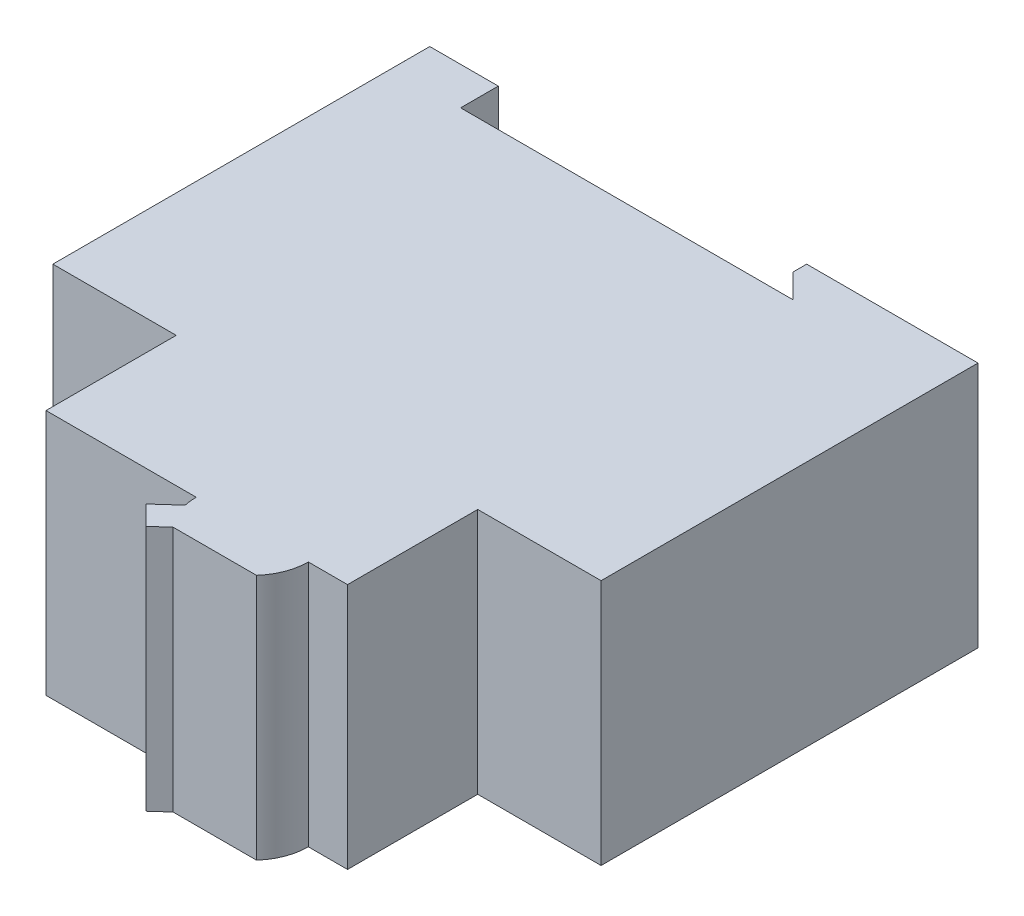
ISO-10303-21;
HEADER;
FILE_DESCRIPTION(('STEP AP214'),'2;1');
FILE_NAME('part.step','',(''),(''),'','','');
FILE_SCHEMA(('AUTOMOTIVE_DESIGN { 1 0 10303 214 1 1 1 1 }'));
ENDSEC;
DATA;
#1=APPLICATION_CONTEXT('core data for automotive mechanical design processes');
#2=APPLICATION_PROTOCOL_DEFINITION('international standard','automotive_design',2000,#1);
#3=PRODUCT_CONTEXT('',#1,'mechanical');
#4=PRODUCT('Part','Part','',(#3));
#5=PRODUCT_RELATED_PRODUCT_CATEGORY('part','',(#4));
#6=PRODUCT_DEFINITION_FORMATION('','',#4);
#7=PRODUCT_DEFINITION_CONTEXT('part definition',#1,'design');
#8=PRODUCT_DEFINITION('design','',#6,#7);
#9=PRODUCT_DEFINITION_SHAPE('','',#8);
#10=(LENGTH_UNIT() NAMED_UNIT(*) SI_UNIT(.MILLI.,.METRE.));
#11=(NAMED_UNIT(*) PLANE_ANGLE_UNIT() SI_UNIT($,.RADIAN.));
#12=(NAMED_UNIT(*) SI_UNIT($,.STERADIAN.) SOLID_ANGLE_UNIT());
#13=UNCERTAINTY_MEASURE_WITH_UNIT(LENGTH_MEASURE(1.E-05),#10,'distance_accuracy_value','');
#14=(GEOMETRIC_REPRESENTATION_CONTEXT(3) GLOBAL_UNCERTAINTY_ASSIGNED_CONTEXT((#13)) GLOBAL_UNIT_ASSIGNED_CONTEXT((#10,
#11,#12)) REPRESENTATION_CONTEXT('',''));
#15=CARTESIAN_POINT('',(0.,0.,0.));
#16=DIRECTION('',(0.,0.,1.));
#17=DIRECTION('',(1.,0.,0.));
#18=AXIS2_PLACEMENT_3D('',#15,#16,#17);
#19=CARTESIAN_POINT('',(0.,-31.,85.));
#20=DIRECTION('',(0.,1.,0.));
#21=DIRECTION('',(0.,0.,1.));
#22=AXIS2_PLACEMENT_3D('',#19,#20,#21);
#23=PLANE('',#22);
#24=DIRECTION('',(-1.,0.,0.));
#25=VECTOR('',#24,1.);
#26=CARTESIAN_POINT('',(0.,-31.,74.));
#27=LINE('',#26,#25);
#28=CARTESIAN_POINT('',(39.9193789701094,-31.,74.));
#29=VERTEX_POINT('',#28);
#30=CARTESIAN_POINT('',(18.,-31.,74.));
#31=VERTEX_POINT('',#30);
#32=EDGE_CURVE('E198',#29,#31,#27,.T.);
#33=ORIENTED_EDGE('',*,*,#32,.T.);
#34=DIRECTION('',(0.,0.,-1.));
#35=VECTOR('',#34,1.);
#36=CARTESIAN_POINT('',(18.,-31.,85.));
#37=LINE('',#36,#35);
#38=CARTESIAN_POINT('',(18.,-31.,55.));
#39=VERTEX_POINT('',#38);
#40=EDGE_CURVE('E272',#31,#39,#37,.T.);
#41=ORIENTED_EDGE('',*,*,#40,.T.);
#42=DIRECTION('',(-1.,0.,0.));
#43=VECTOR('',#42,1.);
#44=CARTESIAN_POINT('',(0.,-31.,55.));
#45=LINE('',#44,#43);
#46=CARTESIAN_POINT('',(0.,-31.,55.));
#47=VERTEX_POINT('',#46);
#48=EDGE_CURVE('E275',#39,#47,#45,.T.);
#49=ORIENTED_EDGE('',*,*,#48,.T.);
#50=DIRECTION('',(0.,0.,-1.));
#51=VECTOR('',#50,1.);
#52=CARTESIAN_POINT('',(0.,-31.,85.));
#53=LINE('',#52,#51);
#54=CARTESIAN_POINT('',(0.,-31.,0.));
#55=VERTEX_POINT('',#54);
#56=EDGE_CURVE('E298',#47,#55,#53,.T.);
#57=ORIENTED_EDGE('',*,*,#56,.T.);
#58=DIRECTION('',(1.,0.,0.));
#59=VECTOR('',#58,1.);
#60=CARTESIAN_POINT('',(0.,-31.,0.));
#61=LINE('',#60,#59);
#62=CARTESIAN_POINT('',(10.,-31.,0.));
#63=VERTEX_POINT('',#62);
#64=EDGE_CURVE('E290',#55,#63,#61,.T.);
#65=ORIENTED_EDGE('',*,*,#64,.T.);
#66=DIRECTION('',(0.,0.,1.));
#67=VECTOR('',#66,1.);
#68=CARTESIAN_POINT('',(10.,-31.,0.));
#69=LINE('',#68,#67);
#70=CARTESIAN_POINT('',(10.,-31.,5.5));
#71=VERTEX_POINT('',#70);
#72=EDGE_CURVE('E237',#63,#71,#69,.T.);
#73=ORIENTED_EDGE('',*,*,#72,.T.);
#74=DIRECTION('',(1.,0.,0.));
#75=VECTOR('',#74,1.);
#76=CARTESIAN_POINT('',(0.,-31.,5.5));
#77=LINE('',#76,#75);
#78=CARTESIAN_POINT('',(58.4999999999999,-31.,5.5));
#79=VERTEX_POINT('',#78);
#80=EDGE_CURVE('E234',#71,#79,#77,.T.);
#81=ORIENTED_EDGE('',*,*,#80,.T.);
#82=DIRECTION('',(0.70710678118654,0.,0.707106781186556));
#83=VECTOR('',#82,1.);
#84=CARTESIAN_POINT('',(26.5000000000006,-31.,-26.5));
#85=LINE('',#84,#83);
#86=CARTESIAN_POINT('',(55.,-31.,2.));
#87=VERTEX_POINT('',#86);
#88=EDGE_CURVE('E232',#87,#79,#85,.T.);
#89=ORIENTED_EDGE('',*,*,#88,.F.);
#90=DIRECTION('',(0.,0.,1.));
#91=VECTOR('',#90,1.);
#92=CARTESIAN_POINT('',(55.,-31.,0.));
#93=LINE('',#92,#91);
#94=CARTESIAN_POINT('',(55.,-31.,0.));
#95=VERTEX_POINT('',#94);
#96=EDGE_CURVE('E216',#95,#87,#93,.T.);
#97=ORIENTED_EDGE('',*,*,#96,.F.);
#98=CARTESIAN_POINT('',(80.,-31.,0.));
#99=VERTEX_POINT('',#98);
#100=EDGE_CURVE('E289',#95,#99,#61,.T.);
#101=ORIENTED_EDGE('',*,*,#100,.T.);
#102=DIRECTION('',(0.,0.,-1.));
#103=VECTOR('',#102,1.);
#104=CARTESIAN_POINT('',(80.,-31.,85.));
#105=LINE('',#104,#103);
#106=CARTESIAN_POINT('',(80.,-31.,55.));
#107=VERTEX_POINT('',#106);
#108=EDGE_CURVE('E295',#107,#99,#105,.T.);
#109=ORIENTED_EDGE('',*,*,#108,.F.);
#110=DIRECTION('',(-1.,0.,0.));
#111=VECTOR('',#110,1.);
#112=CARTESIAN_POINT('',(0.,-31.,55.));
#113=LINE('',#112,#111);
#114=CARTESIAN_POINT('',(62.,-31.,55.));
#115=VERTEX_POINT('',#114);
#116=EDGE_CURVE('E284',#107,#115,#113,.T.);
#117=ORIENTED_EDGE('',*,*,#116,.T.);
#118=DIRECTION('',(0.,0.,1.));
#119=VECTOR('',#118,1.);
#120=CARTESIAN_POINT('',(62.,-31.,85.));
#121=LINE('',#120,#119);
#122=CARTESIAN_POINT('',(62.,-31.,74.));
#123=VERTEX_POINT('',#122);
#124=EDGE_CURVE('E197',#115,#123,#121,.T.);
#125=ORIENTED_EDGE('',*,*,#124,.T.);
#126=DIRECTION('',(-1.,0.,0.));
#127=VECTOR('',#126,1.);
#128=CARTESIAN_POINT('',(0.,-31.,74.));
#129=LINE('',#128,#127);
#130=CARTESIAN_POINT('',(56.2798417876385,-31.,74.));
#131=VERTEX_POINT('',#130);
#132=EDGE_CURVE('E179',#123,#131,#129,.T.);
#133=ORIENTED_EDGE('',*,*,#132,.T.);
#134=CARTESIAN_POINT('',(48.0996103788739,-31.,74.));
#135=DIRECTION('',(0.,-1.,0.));
#136=DIRECTION('',(0.,0.,-1.));
#137=AXIS2_PLACEMENT_3D('',#134,#135,#136);
#138=CIRCLE('',#137,8.18023140876453);
#139=CARTESIAN_POINT('',(54.1829000062319,-31.,79.4689828314429));
#140=VERTEX_POINT('',#139);
#141=EDGE_CURVE('E186',#131,#140,#138,.T.);
#142=ORIENTED_EDGE('',*,*,#141,.T.);
#143=DIRECTION('',(1.,0.,0.));
#144=VECTOR('',#143,1.);
#145=CARTESIAN_POINT('',(0.,-31.,79.4689828314429));
#146=LINE('',#145,#144);
#147=CARTESIAN_POINT('',(42.0163207515159,-31.,79.4689828314428));
#148=VERTEX_POINT('',#147);
#149=EDGE_CURVE('E183',#148,#140,#146,.T.);
#150=ORIENTED_EDGE('',*,*,#149,.F.);
#151=DIRECTION('',(-0.743657400796777,0.,0.668560894937912));
#152=VECTOR('',#151,1.);
#153=CARTESIAN_POINT('',(58.2905984360562,-31.,64.8381250714222));
#154=LINE('',#153,#152);
#155=CARTESIAN_POINT('',(39.9193789701094,-31.,81.354169844317));
#156=VERTEX_POINT('',#155);
#157=EDGE_CURVE('E211',#148,#156,#154,.T.);
#158=ORIENTED_EDGE('',*,*,#157,.T.);
#159=DIRECTION('',(0.70710678118655,0.,0.707106781186545));
#160=VECTOR('',#159,1.);
#161=CARTESIAN_POINT('',(-20.717395437104,-31.,20.7173954371041));
#162=LINE('',#161,#160);
#163=CARTESIAN_POINT('',(37.0909518453632,-31.,78.5257427195709));
#164=VERTEX_POINT('',#163);
#165=EDGE_CURVE('E208',#164,#156,#162,.T.);
#166=ORIENTED_EDGE('',*,*,#165,.F.);
#167=DIRECTION('',(-0.743657400796777,0.,0.668560894937912));
#168=VECTOR('',#167,1.);
#169=CARTESIAN_POINT('',(55.6201278571721,-31.,61.8676922737012));
#170=LINE('',#169,#168);
#171=CARTESIAN_POINT('',(40.1203789573312,-31.,75.8022352294867));
#172=VERTEX_POINT('',#171);
#173=EDGE_CURVE('E205',#172,#164,#170,.T.);
#174=ORIENTED_EDGE('',*,*,#173,.F.);
#175=CARTESIAN_POINT('',(48.0996103788739,-31.,74.));
#176=DIRECTION('',(0.,-1.,0.));
#177=DIRECTION('',(0.,0.,-1.));
#178=AXIS2_PLACEMENT_3D('',#175,#176,#177);
#179=CIRCLE('',#178,8.18023140876454);
#180=EDGE_CURVE('E200',#172,#29,#179,.T.);
#181=ORIENTED_EDGE('',*,*,#180,.T.);
#182=EDGE_LOOP('',(#33,#41,#49,#57,#65,#73,#81,#89,#97,#101,#109,#117,#125,#133,#142,#150,#158,
#166,#174,#181));
#183=FACE_BOUND('',#182,.T.);
#184=ADVANCED_FACE('F40',(#183),#23,.F.);
#185=CARTESIAN_POINT('',(62.,-100.,85.));
#186=DIRECTION('',(-1.,0.,0.));
#187=DIRECTION('',(0.,0.,1.));
#188=AXIS2_PLACEMENT_3D('',#185,#186,#187);
#189=PLANE('',#188);
#190=DIRECTION('',(0.,-1.,0.));
#191=VECTOR('',#190,1.);
#192=CARTESIAN_POINT('',(62.,79.,74.));
#193=LINE('',#192,#191);
#194=CARTESIAN_POINT('',(62.,5.,74.));
#195=VERTEX_POINT('',#194);
#196=EDGE_CURVE('E55',#195,#123,#193,.T.);
#197=ORIENTED_EDGE('',*,*,#196,.T.);
#198=ORIENTED_EDGE('',*,*,#124,.F.);
#199=DIRECTION('',(0.,1.,0.));
#200=VECTOR('',#199,1.);
#201=CARTESIAN_POINT('',(62.,-100.,55.));
#202=LINE('',#201,#200);
#203=CARTESIAN_POINT('',(62.,5.,55.));
#204=VERTEX_POINT('',#203);
#205=EDGE_CURVE('E279',#115,#204,#202,.T.);
#206=ORIENTED_EDGE('',*,*,#205,.T.);
#207=DIRECTION('',(0.,0.,-1.));
#208=VECTOR('',#207,1.);
#209=CARTESIAN_POINT('',(62.,5.,0.));
#210=LINE('',#209,#208);
#211=EDGE_CURVE('E257',#195,#204,#210,.T.);
#212=ORIENTED_EDGE('',*,*,#211,.F.);
#213=EDGE_LOOP('',(#197,#198,#206,#212));
#214=FACE_BOUND('',#213,.T.);
#215=ADVANCED_FACE('F361',(#214),#189,.F.);
#216=CARTESIAN_POINT('',(18.,-100.,85.));
#217=DIRECTION('',(1.,0.,0.));
#218=DIRECTION('',(0.,0.,-1.));
#219=AXIS2_PLACEMENT_3D('',#216,#217,#218);
#220=PLANE('',#219);
#221=DIRECTION('',(0.,-1.,0.));
#222=VECTOR('',#221,1.);
#223=CARTESIAN_POINT('',(18.,79.,74.));
#224=LINE('',#223,#222);
#225=CARTESIAN_POINT('',(18.,5.,74.));
#226=VERTEX_POINT('',#225);
#227=EDGE_CURVE('E227',#226,#31,#224,.T.);
#228=ORIENTED_EDGE('',*,*,#227,.F.);
#229=DIRECTION('',(0.,0.,1.));
#230=VECTOR('',#229,1.);
#231=CARTESIAN_POINT('',(18.,5.,0.));
#232=LINE('',#231,#230);
#233=CARTESIAN_POINT('',(18.,5.,55.));
#234=VERTEX_POINT('',#233);
#235=EDGE_CURVE('E253',#234,#226,#232,.T.);
#236=ORIENTED_EDGE('',*,*,#235,.F.);
#237=DIRECTION('',(0.,1.,0.));
#238=VECTOR('',#237,1.);
#239=CARTESIAN_POINT('',(18.,-100.,55.));
#240=LINE('',#239,#238);
#241=EDGE_CURVE('E269',#39,#234,#240,.T.);
#242=ORIENTED_EDGE('',*,*,#241,.F.);
#243=ORIENTED_EDGE('',*,*,#40,.F.);
#244=EDGE_LOOP('',(#228,#236,#242,#243));
#245=FACE_BOUND('',#244,.T.);
#246=ADVANCED_FACE('F365',(#245),#220,.F.);
#247=CARTESIAN_POINT('',(0.,5.,0.));
#248=DIRECTION('',(0.,1.,0.));
#249=DIRECTION('',(0.,0.,1.));
#250=AXIS2_PLACEMENT_3D('',#247,#248,#249);
#251=PLANE('',#250);
#252=ORIENTED_EDGE('',*,*,#235,.T.);
#253=DIRECTION('',(1.,0.,0.));
#254=VECTOR('',#253,1.);
#255=CARTESIAN_POINT('',(0.,5.,74.));
#256=LINE('',#255,#254);
#257=CARTESIAN_POINT('',(39.9193789701094,5.,74.));
#258=VERTEX_POINT('',#257);
#259=EDGE_CURVE('E11',#226,#258,#256,.T.);
#260=ORIENTED_EDGE('',*,*,#259,.T.);
#261=CARTESIAN_POINT('',(48.0996103788739,5.,74.));
#262=DIRECTION('',(0.,1.,0.));
#263=DIRECTION('',(0.,0.,1.));
#264=AXIS2_PLACEMENT_3D('',#261,#262,#263);
#265=CIRCLE('',#264,8.18023140876454);
#266=CARTESIAN_POINT('',(40.1203789573312,5.,75.8022352294867));
#267=VERTEX_POINT('',#266);
#268=EDGE_CURVE('E48',#258,#267,#265,.T.);
#269=ORIENTED_EDGE('',*,*,#268,.T.);
#270=DIRECTION('',(0.743657400796777,0.,-0.668560894937912));
#271=VECTOR('',#270,1.);
#272=CARTESIAN_POINT('',(55.6201278571721,5.,61.8676922737012));
#273=LINE('',#272,#271);
#274=CARTESIAN_POINT('',(37.0909518453632,5.,78.5257427195709));
#275=VERTEX_POINT('',#274);
#276=EDGE_CURVE('E320',#275,#267,#273,.T.);
#277=ORIENTED_EDGE('',*,*,#276,.F.);
#278=DIRECTION('',(-0.70710678118655,0.,-0.707106781186545));
#279=VECTOR('',#278,1.);
#280=CARTESIAN_POINT('',(-20.717395437104,5.,20.7173954371041));
#281=LINE('',#280,#279);
#282=CARTESIAN_POINT('',(39.9193789701094,5.,81.354169844317));
#283=VERTEX_POINT('',#282);
#284=EDGE_CURVE('E318',#283,#275,#281,.T.);
#285=ORIENTED_EDGE('',*,*,#284,.F.);
#286=DIRECTION('',(0.743657400796777,0.,-0.668560894937912));
#287=VECTOR('',#286,1.);
#288=CARTESIAN_POINT('',(58.2905984360562,5.,64.8381250714222));
#289=LINE('',#288,#287);
#290=CARTESIAN_POINT('',(42.0163207515159,5.,79.4689828314428));
#291=VERTEX_POINT('',#290);
#292=EDGE_CURVE('E315',#283,#291,#289,.T.);
#293=ORIENTED_EDGE('',*,*,#292,.T.);
#294=DIRECTION('',(-1.,0.,0.));
#295=VECTOR('',#294,1.);
#296=CARTESIAN_POINT('',(0.,5.,79.4689828314429));
#297=LINE('',#296,#295);
#298=CARTESIAN_POINT('',(54.1829000062319,5.,79.4689828314429));
#299=VERTEX_POINT('',#298);
#300=EDGE_CURVE('E313',#299,#291,#297,.T.);
#301=ORIENTED_EDGE('',*,*,#300,.F.);
#302=CARTESIAN_POINT('',(48.0996103788739,5.,74.));
#303=DIRECTION('',(0.,1.,0.));
#304=DIRECTION('',(0.,0.,1.));
#305=AXIS2_PLACEMENT_3D('',#302,#303,#304);
#306=CIRCLE('',#305,8.18023140876453);
#307=CARTESIAN_POINT('',(56.2798417876385,5.,74.));
#308=VERTEX_POINT('',#307);
#309=EDGE_CURVE('E311',#299,#308,#306,.T.);
#310=ORIENTED_EDGE('',*,*,#309,.T.);
#311=DIRECTION('',(1.,0.,0.));
#312=VECTOR('',#311,1.);
#313=CARTESIAN_POINT('',(0.,5.,74.));
#314=LINE('',#313,#312);
#315=EDGE_CURVE('E180',#308,#195,#314,.T.);
#316=ORIENTED_EDGE('',*,*,#315,.T.);
#317=ORIENTED_EDGE('',*,*,#211,.T.);
#318=DIRECTION('',(1.,0.,0.));
#319=VECTOR('',#318,1.);
#320=CARTESIAN_POINT('',(0.,5.,55.));
#321=LINE('',#320,#319);
#322=CARTESIAN_POINT('',(80.,5.,55.));
#323=VERTEX_POINT('',#322);
#324=EDGE_CURVE('E254',#204,#323,#321,.T.);
#325=ORIENTED_EDGE('',*,*,#324,.T.);
#326=DIRECTION('',(0.,0.,-1.));
#327=VECTOR('',#326,1.);
#328=CARTESIAN_POINT('',(80.,5.,0.));
#329=LINE('',#328,#327);
#330=CARTESIAN_POINT('',(80.,5.,0.));
#331=VERTEX_POINT('',#330);
#332=EDGE_CURVE('E259',#323,#331,#329,.T.);
#333=ORIENTED_EDGE('',*,*,#332,.T.);
#334=DIRECTION('',(-1.,0.,0.));
#335=VECTOR('',#334,1.);
#336=CARTESIAN_POINT('',(0.,5.,0.));
#337=LINE('',#336,#335);
#338=CARTESIAN_POINT('',(55.,5.,0.));
#339=VERTEX_POINT('',#338);
#340=EDGE_CURVE('E263',#331,#339,#337,.T.);
#341=ORIENTED_EDGE('',*,*,#340,.T.);
#342=DIRECTION('',(0.,0.,-1.));
#343=VECTOR('',#342,1.);
#344=CARTESIAN_POINT('',(55.,5.,0.));
#345=LINE('',#344,#343);
#346=CARTESIAN_POINT('',(55.,5.,2.));
#347=VERTEX_POINT('',#346);
#348=EDGE_CURVE('E308',#347,#339,#345,.T.);
#349=ORIENTED_EDGE('',*,*,#348,.F.);
#350=DIRECTION('',(-0.707106781186539,0.,-0.707106781186556));
#351=VECTOR('',#350,1.);
#352=CARTESIAN_POINT('',(26.5000000000006,5.,-26.5));
#353=LINE('',#352,#351);
#354=CARTESIAN_POINT('',(58.4999999999999,5.,5.49999999999999));
#355=VERTEX_POINT('',#354);
#356=EDGE_CURVE('E300',#355,#347,#353,.T.);
#357=ORIENTED_EDGE('',*,*,#356,.F.);
#358=DIRECTION('',(-1.,0.,0.));
#359=VECTOR('',#358,1.);
#360=CARTESIAN_POINT('',(0.,5.,5.5));
#361=LINE('',#360,#359);
#362=CARTESIAN_POINT('',(10.,5.,5.5));
#363=VERTEX_POINT('',#362);
#364=EDGE_CURVE('E302',#355,#363,#361,.T.);
#365=ORIENTED_EDGE('',*,*,#364,.T.);
#366=DIRECTION('',(0.,0.,-1.));
#367=VECTOR('',#366,1.);
#368=CARTESIAN_POINT('',(10.,5.,0.));
#369=LINE('',#368,#367);
#370=CARTESIAN_POINT('',(10.,5.,0.));
#371=VERTEX_POINT('',#370);
#372=EDGE_CURVE('E305',#363,#371,#369,.T.);
#373=ORIENTED_EDGE('',*,*,#372,.T.);
#374=CARTESIAN_POINT('',(0.,5.,0.));
#375=VERTEX_POINT('',#374);
#376=EDGE_CURVE('E262',#371,#375,#337,.T.);
#377=ORIENTED_EDGE('',*,*,#376,.T.);
#378=DIRECTION('',(0.,0.,1.));
#379=VECTOR('',#378,1.);
#380=CARTESIAN_POINT('',(0.,5.,0.));
#381=LINE('',#380,#379);
#382=CARTESIAN_POINT('',(0.,5.,55.));
#383=VERTEX_POINT('',#382);
#384=EDGE_CURVE('E266',#375,#383,#381,.T.);
#385=ORIENTED_EDGE('',*,*,#384,.T.);
#386=EDGE_CURVE('E243',#383,#234,#321,.T.);
#387=ORIENTED_EDGE('',*,*,#386,.T.);
#388=EDGE_LOOP('',(#252,#260,#269,#277,#285,#293,#301,#310,#316,#317,#325,#333,#341,#349,#357,
#365,#373,#377,#385,#387));
#389=FACE_BOUND('',#388,.T.);
#390=ADVANCED_FACE('F324',(#389),#251,.T.);
#391=CARTESIAN_POINT('',(0.,0.,0.));
#392=DIRECTION('',(0.,0.,1.));
#393=DIRECTION('',(1.,0.,0.));
#394=AXIS2_PLACEMENT_3D('',#391,#392,#393);
#395=PLANE('',#394);
#396=DIRECTION('',(0.,-1.,0.));
#397=VECTOR('',#396,1.);
#398=CARTESIAN_POINT('',(10.,79.,0.));
#399=LINE('',#398,#397);
#400=EDGE_CURVE('E244',#371,#63,#399,.T.);
#401=ORIENTED_EDGE('',*,*,#400,.T.);
#402=ORIENTED_EDGE('',*,*,#64,.F.);
#403=DIRECTION('',(0.,-1.,0.));
#404=VECTOR('',#403,1.);
#405=CARTESIAN_POINT('',(0.,0.,0.));
#406=LINE('',#405,#404);
#407=EDGE_CURVE('E286',#375,#55,#406,.T.);
#408=ORIENTED_EDGE('',*,*,#407,.F.);
#409=ORIENTED_EDGE('',*,*,#376,.F.);
#410=EDGE_LOOP('',(#401,#402,#408,#409));
#411=FACE_BOUND('',#410,.T.);
#412=ADVANCED_FACE('F378',(#411),#395,.F.);
#413=CARTESIAN_POINT('',(0.,0.,85.));
#414=DIRECTION('',(1.,0.,0.));
#415=DIRECTION('',(0.,1.,0.));
#416=AXIS2_PLACEMENT_3D('',#413,#414,#415);
#417=PLANE('',#416);
#418=ORIENTED_EDGE('',*,*,#56,.F.);
#419=DIRECTION('',(0.,1.,0.));
#420=VECTOR('',#419,1.);
#421=CARTESIAN_POINT('',(0.,-100.,55.));
#422=LINE('',#421,#420);
#423=EDGE_CURVE('E270',#47,#383,#422,.T.);
#424=ORIENTED_EDGE('',*,*,#423,.T.);
#425=ORIENTED_EDGE('',*,*,#384,.F.);
#426=ORIENTED_EDGE('',*,*,#407,.T.);
#427=EDGE_LOOP('',(#418,#424,#425,#426));
#428=FACE_BOUND('',#427,.T.);
#429=ADVANCED_FACE('F42',(#428),#417,.F.);
#430=CARTESIAN_POINT('',(80.,0.,85.));
#431=DIRECTION('',(-1.,0.,0.));
#432=DIRECTION('',(0.,0.,1.));
#433=AXIS2_PLACEMENT_3D('',#430,#431,#432);
#434=PLANE('',#433);
#435=DIRECTION('',(0.,1.,0.));
#436=VECTOR('',#435,1.);
#437=CARTESIAN_POINT('',(80.,0.,0.));
#438=LINE('',#437,#436);
#439=EDGE_CURVE('E293',#99,#331,#438,.T.);
#440=ORIENTED_EDGE('',*,*,#439,.T.);
#441=ORIENTED_EDGE('',*,*,#332,.F.);
#442=DIRECTION('',(0.,1.,0.));
#443=VECTOR('',#442,1.);
#444=CARTESIAN_POINT('',(80.,-100.,55.));
#445=LINE('',#444,#443);
#446=EDGE_CURVE('E278',#107,#323,#445,.T.);
#447=ORIENTED_EDGE('',*,*,#446,.F.);
#448=ORIENTED_EDGE('',*,*,#108,.T.);
#449=EDGE_LOOP('',(#440,#441,#447,#448));
#450=FACE_BOUND('',#449,.T.);
#451=ADVANCED_FACE('F369',(#450),#434,.F.);
#452=ORIENTED_EDGE('',*,*,#100,.F.);
#453=DIRECTION('',(0.,-1.,0.));
#454=VECTOR('',#453,1.);
#455=CARTESIAN_POINT('',(55.,79.,0.));
#456=LINE('',#455,#454);
#457=EDGE_CURVE('E241',#339,#95,#456,.T.);
#458=ORIENTED_EDGE('',*,*,#457,.F.);
#459=ORIENTED_EDGE('',*,*,#340,.F.);
#460=ORIENTED_EDGE('',*,*,#439,.F.);
#461=EDGE_LOOP('',(#452,#458,#459,#460));
#462=FACE_BOUND('',#461,.T.);
#463=ADVANCED_FACE('F372',(#462),#395,.F.);
#464=CARTESIAN_POINT('',(80.,-100.,55.));
#465=DIRECTION('',(0.,0.,-1.));
#466=DIRECTION('',(-1.,0.,0.));
#467=AXIS2_PLACEMENT_3D('',#464,#465,#466);
#468=PLANE('',#467);
#469=ORIENTED_EDGE('',*,*,#446,.T.);
#470=ORIENTED_EDGE('',*,*,#324,.F.);
#471=ORIENTED_EDGE('',*,*,#205,.F.);
#472=ORIENTED_EDGE('',*,*,#116,.F.);
#473=EDGE_LOOP('',(#469,#470,#471,#472));
#474=FACE_BOUND('',#473,.T.);
#475=ADVANCED_FACE('F376',(#474),#468,.F.);
#476=CARTESIAN_POINT('',(0.,-100.,55.));
#477=DIRECTION('',(0.,0.,-1.));
#478=DIRECTION('',(-1.,0.,0.));
#479=AXIS2_PLACEMENT_3D('',#476,#477,#478);
#480=PLANE('',#479);
#481=ORIENTED_EDGE('',*,*,#241,.T.);
#482=ORIENTED_EDGE('',*,*,#386,.F.);
#483=ORIENTED_EDGE('',*,*,#423,.F.);
#484=ORIENTED_EDGE('',*,*,#48,.F.);
#485=EDGE_LOOP('',(#481,#482,#483,#484));
#486=FACE_BOUND('',#485,.T.);
#487=ADVANCED_FACE('F380',(#486),#480,.F.);
#488=CARTESIAN_POINT('',(55.,79.,0.));
#489=DIRECTION('',(1.,0.,0.));
#490=DIRECTION('',(0.,0.,-1.));
#491=AXIS2_PLACEMENT_3D('',#488,#489,#490);
#492=PLANE('',#491);
#493=ORIENTED_EDGE('',*,*,#348,.T.);
#494=ORIENTED_EDGE('',*,*,#457,.T.);
#495=ORIENTED_EDGE('',*,*,#96,.T.);
#496=DIRECTION('',(0.,-1.,0.));
#497=VECTOR('',#496,1.);
#498=CARTESIAN_POINT('',(55.,79.,2.));
#499=LINE('',#498,#497);
#500=EDGE_CURVE('E240',#347,#87,#499,.T.);
#501=ORIENTED_EDGE('',*,*,#500,.F.);
#502=EDGE_LOOP('',(#493,#494,#495,#501));
#503=FACE_BOUND('',#502,.T.);
#504=ADVANCED_FACE('F388',(#503),#492,.F.);
#505=CARTESIAN_POINT('',(10.,79.,0.));
#506=DIRECTION('',(1.,0.,0.));
#507=DIRECTION('',(0.,0.,-1.));
#508=AXIS2_PLACEMENT_3D('',#505,#506,#507);
#509=PLANE('',#508);
#510=DIRECTION('',(0.,-1.,0.));
#511=VECTOR('',#510,1.);
#512=CARTESIAN_POINT('',(10.,79.,5.5));
#513=LINE('',#512,#511);
#514=EDGE_CURVE('E247',#363,#71,#513,.T.);
#515=ORIENTED_EDGE('',*,*,#514,.T.);
#516=ORIENTED_EDGE('',*,*,#72,.F.);
#517=ORIENTED_EDGE('',*,*,#400,.F.);
#518=ORIENTED_EDGE('',*,*,#372,.F.);
#519=EDGE_LOOP('',(#515,#516,#517,#518));
#520=FACE_BOUND('',#519,.T.);
#521=ADVANCED_FACE('F394',(#520),#509,.T.);
#522=CARTESIAN_POINT('',(0.,79.,5.5));
#523=DIRECTION('',(0.,0.,-1.));
#524=DIRECTION('',(-1.,0.,0.));
#525=AXIS2_PLACEMENT_3D('',#522,#523,#524);
#526=PLANE('',#525);
#527=DIRECTION('',(0.,-1.,0.));
#528=VECTOR('',#527,1.);
#529=CARTESIAN_POINT('',(58.4999999999999,79.,5.5));
#530=LINE('',#529,#528);
#531=EDGE_CURVE('E63',#355,#79,#530,.T.);
#532=ORIENTED_EDGE('',*,*,#531,.T.);
#533=ORIENTED_EDGE('',*,*,#80,.F.);
#534=ORIENTED_EDGE('',*,*,#514,.F.);
#535=ORIENTED_EDGE('',*,*,#364,.F.);
#536=EDGE_LOOP('',(#532,#533,#534,#535));
#537=FACE_BOUND('',#536,.T.);
#538=ADVANCED_FACE('F398',(#537),#526,.T.);
#539=CARTESIAN_POINT('',(26.5000000000006,79.,-26.5));
#540=DIRECTION('',(0.707106781186556,0.,-0.707106781186539));
#541=DIRECTION('',(-0.707106781186539,0.,-0.707106781186556));
#542=AXIS2_PLACEMENT_3D('',#539,#540,#541);
#543=PLANE('',#542);
#544=ORIENTED_EDGE('',*,*,#356,.T.);
#545=ORIENTED_EDGE('',*,*,#500,.T.);
#546=ORIENTED_EDGE('',*,*,#88,.T.);
#547=ORIENTED_EDGE('',*,*,#531,.F.);
#548=EDGE_LOOP('',(#544,#545,#546,#547));
#549=FACE_BOUND('',#548,.T.);
#550=ADVANCED_FACE('F358',(#549),#543,.F.);
#551=CARTESIAN_POINT('',(48.0996103788739,79.,74.));
#552=DIRECTION('',(0.,-1.,0.));
#553=DIRECTION('',(0.,0.,-1.));
#554=AXIS2_PLACEMENT_3D('',#551,#552,#553);
#555=CYLINDRICAL_SURFACE('',#554,8.18023140876453);
#556=DIRECTION('',(0.,-1.,0.));
#557=VECTOR('',#556,1.);
#558=CARTESIAN_POINT('',(54.1829000062319,79.,79.4689828314429));
#559=LINE('',#558,#557);
#560=EDGE_CURVE('E189',#299,#140,#559,.T.);
#561=ORIENTED_EDGE('',*,*,#560,.T.);
#562=ORIENTED_EDGE('',*,*,#141,.F.);
#563=DIRECTION('',(0.,-1.,0.));
#564=VECTOR('',#563,1.);
#565=CARTESIAN_POINT('',(56.2798417876385,79.,74.));
#566=LINE('',#565,#564);
#567=EDGE_CURVE('E175',#308,#131,#566,.T.);
#568=ORIENTED_EDGE('',*,*,#567,.F.);
#569=ORIENTED_EDGE('',*,*,#309,.F.);
#570=EDGE_LOOP('',(#561,#562,#568,#569));
#571=FACE_BOUND('',#570,.T.);
#572=ADVANCED_FACE('F187',(#571),#555,.T.);
#573=CARTESIAN_POINT('',(0.,79.,79.4689828314429));
#574=DIRECTION('',(0.,0.,-1.));
#575=DIRECTION('',(-1.,0.,0.));
#576=AXIS2_PLACEMENT_3D('',#573,#574,#575);
#577=PLANE('',#576);
#578=ORIENTED_EDGE('',*,*,#300,.T.);
#579=DIRECTION('',(0.,-1.,0.));
#580=VECTOR('',#579,1.);
#581=CARTESIAN_POINT('',(42.0163207515159,79.,79.4689828314428));
#582=LINE('',#581,#580);
#583=EDGE_CURVE('E217',#291,#148,#582,.T.);
#584=ORIENTED_EDGE('',*,*,#583,.T.);
#585=ORIENTED_EDGE('',*,*,#149,.T.);
#586=ORIENTED_EDGE('',*,*,#560,.F.);
#587=EDGE_LOOP('',(#578,#584,#585,#586));
#588=FACE_BOUND('',#587,.T.);
#589=ADVANCED_FACE('F350',(#588),#577,.F.);
#590=CARTESIAN_POINT('',(58.2905984360562,79.,64.8381250714222));
#591=DIRECTION('',(0.668560894937912,0.,0.743657400796777));
#592=DIRECTION('',(0.743657400796777,0.,-0.668560894937912));
#593=AXIS2_PLACEMENT_3D('',#590,#591,#592);
#594=PLANE('',#593);
#595=DIRECTION('',(0.,-1.,0.));
#596=VECTOR('',#595,1.);
#597=CARTESIAN_POINT('',(39.9193789701094,79.,81.354169844317));
#598=LINE('',#597,#596);
#599=EDGE_CURVE('E219',#283,#156,#598,.T.);
#600=ORIENTED_EDGE('',*,*,#599,.T.);
#601=ORIENTED_EDGE('',*,*,#157,.F.);
#602=ORIENTED_EDGE('',*,*,#583,.F.);
#603=ORIENTED_EDGE('',*,*,#292,.F.);
#604=EDGE_LOOP('',(#600,#601,#602,#603));
#605=FACE_BOUND('',#604,.T.);
#606=ADVANCED_FACE('F347',(#605),#594,.T.);
#607=CARTESIAN_POINT('',(-20.717395437104,79.,20.7173954371041));
#608=DIRECTION('',(0.707106781186545,0.,-0.70710678118655));
#609=DIRECTION('',(-0.70710678118655,0.,-0.707106781186545));
#610=AXIS2_PLACEMENT_3D('',#607,#608,#609);
#611=PLANE('',#610);
#612=ORIENTED_EDGE('',*,*,#284,.T.);
#613=DIRECTION('',(0.,-1.,0.));
#614=VECTOR('',#613,1.);
#615=CARTESIAN_POINT('',(37.0909518453632,79.,78.5257427195709));
#616=LINE('',#615,#614);
#617=EDGE_CURVE('E221',#275,#164,#616,.T.);
#618=ORIENTED_EDGE('',*,*,#617,.T.);
#619=ORIENTED_EDGE('',*,*,#165,.T.);
#620=ORIENTED_EDGE('',*,*,#599,.F.);
#621=EDGE_LOOP('',(#612,#618,#619,#620));
#622=FACE_BOUND('',#621,.T.);
#623=ADVANCED_FACE('F342',(#622),#611,.F.);
#624=CARTESIAN_POINT('',(55.6201278571721,79.,61.8676922737012));
#625=DIRECTION('',(0.668560894937912,0.,0.743657400796777));
#626=DIRECTION('',(0.743657400796777,0.,-0.668560894937912));
#627=AXIS2_PLACEMENT_3D('',#624,#625,#626);
#628=PLANE('',#627);
#629=ORIENTED_EDGE('',*,*,#276,.T.);
#630=DIRECTION('',(0.,-1.,0.));
#631=VECTOR('',#630,1.);
#632=CARTESIAN_POINT('',(40.1203789573312,79.,75.8022352294867));
#633=LINE('',#632,#631);
#634=EDGE_CURVE('E223',#267,#172,#633,.T.);
#635=ORIENTED_EDGE('',*,*,#634,.T.);
#636=ORIENTED_EDGE('',*,*,#173,.T.);
#637=ORIENTED_EDGE('',*,*,#617,.F.);
#638=EDGE_LOOP('',(#629,#635,#636,#637));
#639=FACE_BOUND('',#638,.T.);
#640=ADVANCED_FACE('F340',(#639),#628,.F.);
#641=CARTESIAN_POINT('',(48.0996103788739,79.,74.));
#642=DIRECTION('',(0.,-1.,0.));
#643=DIRECTION('',(0.,0.,-1.));
#644=AXIS2_PLACEMENT_3D('',#641,#642,#643);
#645=CYLINDRICAL_SURFACE('',#644,8.18023140876454);
#646=DIRECTION('',(0.,-1.,0.));
#647=VECTOR('',#646,1.);
#648=CARTESIAN_POINT('',(39.9193789701094,79.,74.));
#649=LINE('',#648,#647);
#650=EDGE_CURVE('E225',#258,#29,#649,.T.);
#651=ORIENTED_EDGE('',*,*,#650,.T.);
#652=ORIENTED_EDGE('',*,*,#180,.F.);
#653=ORIENTED_EDGE('',*,*,#634,.F.);
#654=ORIENTED_EDGE('',*,*,#268,.F.);
#655=EDGE_LOOP('',(#651,#652,#653,#654));
#656=FACE_BOUND('',#655,.T.);
#657=ADVANCED_FACE('F329',(#656),#645,.T.);
#658=CARTESIAN_POINT('',(0.,79.,74.));
#659=DIRECTION('',(0.,0.,1.));
#660=DIRECTION('',(1.,0.,0.));
#661=AXIS2_PLACEMENT_3D('',#658,#659,#660);
#662=PLANE('',#661);
#663=ORIENTED_EDGE('',*,*,#227,.T.);
#664=ORIENTED_EDGE('',*,*,#32,.F.);
#665=ORIENTED_EDGE('',*,*,#650,.F.);
#666=ORIENTED_EDGE('',*,*,#259,.F.);
#667=EDGE_LOOP('',(#663,#664,#665,#666));
#668=FACE_BOUND('',#667,.T.);
#669=ADVANCED_FACE('F333',(#668),#662,.T.);
#670=CARTESIAN_POINT('',(0.,79.,74.));
#671=DIRECTION('',(0.,0.,1.));
#672=DIRECTION('',(1.,0.,0.));
#673=AXIS2_PLACEMENT_3D('',#670,#671,#672);
#674=PLANE('',#673);
#675=ORIENTED_EDGE('',*,*,#567,.T.);
#676=ORIENTED_EDGE('',*,*,#132,.F.);
#677=ORIENTED_EDGE('',*,*,#196,.F.);
#678=ORIENTED_EDGE('',*,*,#315,.F.);
#679=EDGE_LOOP('',(#675,#676,#677,#678));
#680=FACE_BOUND('',#679,.T.);
#681=ADVANCED_FACE('F177',(#680),#674,.T.);
#682=CLOSED_SHELL('',(#184,#215,#246,#390,#412,#429,#451,#463,#475,#487,#504,#521,#538,#550,
#572,#589,#606,#623,#640,#657,#669,#681));
#683=MANIFOLD_SOLID_BREP('B2',#682);
#684=ADVANCED_BREP_SHAPE_REPRESENTATION('',(#18,#683),#14);
#685=SHAPE_DEFINITION_REPRESENTATION(#9,#684);
ENDSEC;
END-ISO-10303-21;
